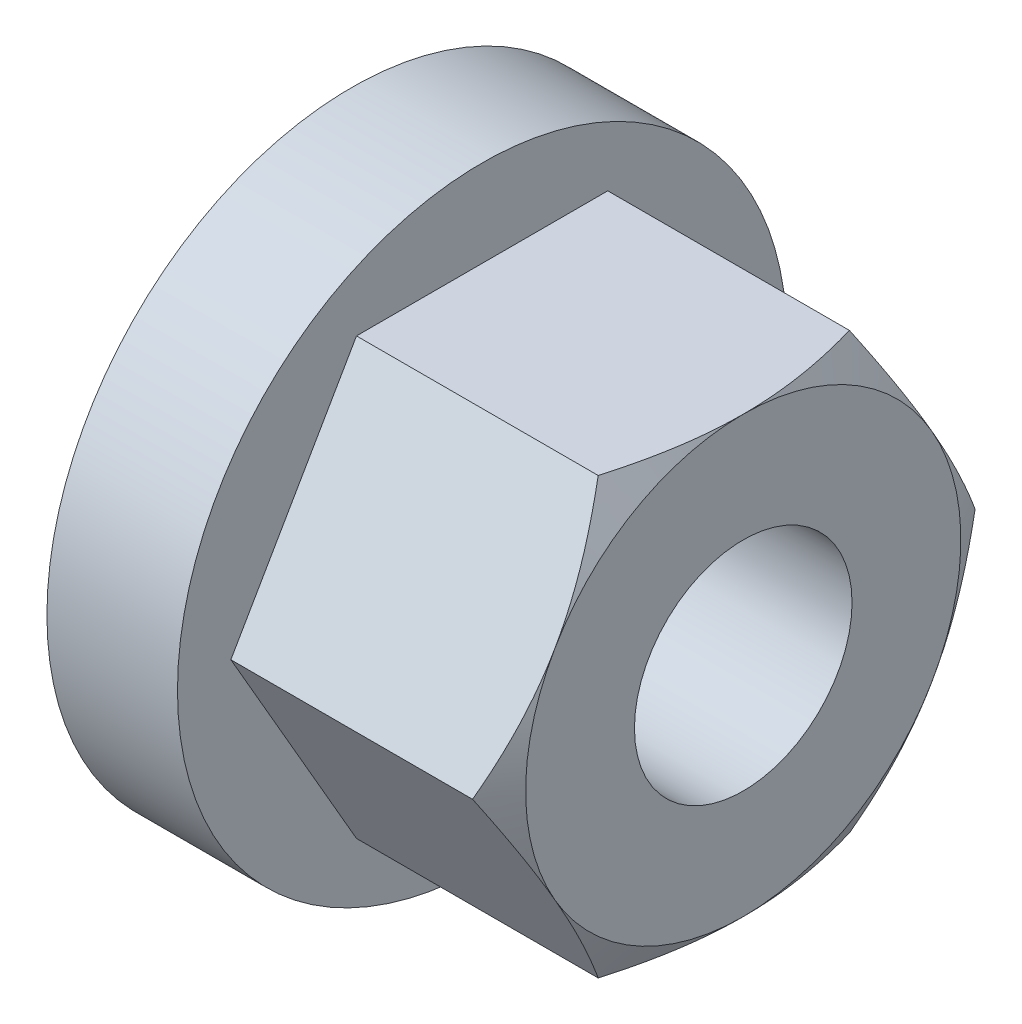
ISO-10303-21;
HEADER;
FILE_DESCRIPTION(('STEP AP214'),'2;1');
FILE_NAME('part.step','',(''),(''),'','','');
FILE_SCHEMA(('AUTOMOTIVE_DESIGN { 1 0 10303 214 1 1 1 1 }'));
ENDSEC;
DATA;
#1=APPLICATION_CONTEXT('core data for automotive mechanical design processes');
#2=APPLICATION_PROTOCOL_DEFINITION('international standard','automotive_design',2000,#1);
#3=PRODUCT_CONTEXT('',#1,'mechanical');
#4=PRODUCT('Part','Part','',(#3));
#5=PRODUCT_RELATED_PRODUCT_CATEGORY('part','',(#4));
#6=PRODUCT_DEFINITION_FORMATION('','',#4);
#7=PRODUCT_DEFINITION_CONTEXT('part definition',#1,'design');
#8=PRODUCT_DEFINITION('design','',#6,#7);
#9=PRODUCT_DEFINITION_SHAPE('','',#8);
#10=(LENGTH_UNIT() NAMED_UNIT(*) SI_UNIT(.MILLI.,.METRE.));
#11=(NAMED_UNIT(*) PLANE_ANGLE_UNIT() SI_UNIT($,.RADIAN.));
#12=(NAMED_UNIT(*) SI_UNIT($,.STERADIAN.) SOLID_ANGLE_UNIT());
#13=UNCERTAINTY_MEASURE_WITH_UNIT(LENGTH_MEASURE(1.E-05),#10,'distance_accuracy_value','');
#14=(GEOMETRIC_REPRESENTATION_CONTEXT(3) GLOBAL_UNCERTAINTY_ASSIGNED_CONTEXT((#13)) GLOBAL_UNIT_ASSIGNED_CONTEXT((#10,
#11,#12)) REPRESENTATION_CONTEXT('',''));
#15=CARTESIAN_POINT('',(0.,0.,0.));
#16=DIRECTION('',(0.,0.,1.));
#17=DIRECTION('',(1.,0.,0.));
#18=AXIS2_PLACEMENT_3D('',#15,#16,#17);
#19=CARTESIAN_POINT('',(9.,-5.,-2.88675134594813));
#20=DIRECTION('',(-1.,0.,0.));
#21=DIRECTION('',(0.,0.,1.));
#22=AXIS2_PLACEMENT_3D('',#19,#20,#21);
#23=PLANE('',#22);
#24=CARTESIAN_POINT('',(9.,0.,0.));
#25=DIRECTION('',(1.,0.,0.));
#26=DIRECTION('',(0.,0.,-1.));
#27=AXIS2_PLACEMENT_3D('',#24,#25,#26);
#28=CIRCLE('',#27,5.);
#29=CARTESIAN_POINT('',(9.,5.,0.));
#30=VERTEX_POINT('',#29);
#31=CARTESIAN_POINT('',(9.,2.5,4.3301270189222));
#32=VERTEX_POINT('',#31);
#33=EDGE_CURVE('E267',#30,#32,#28,.T.);
#34=ORIENTED_EDGE('',*,*,#33,.T.);
#35=CARTESIAN_POINT('',(9.,-2.5,4.33012701892219));
#36=VERTEX_POINT('',#35);
#37=EDGE_CURVE('E264',#32,#36,#28,.T.);
#38=ORIENTED_EDGE('',*,*,#37,.T.);
#39=CARTESIAN_POINT('',(9.,-5.,0.));
#40=VERTEX_POINT('',#39);
#41=EDGE_CURVE('E258',#36,#40,#28,.T.);
#42=ORIENTED_EDGE('',*,*,#41,.T.);
#43=CARTESIAN_POINT('',(9.,-2.5,-4.3301270189222));
#44=VERTEX_POINT('',#43);
#45=EDGE_CURVE('E260',#40,#44,#28,.T.);
#46=ORIENTED_EDGE('',*,*,#45,.T.);
#47=CARTESIAN_POINT('',(9.,2.5,-4.33012701892219));
#48=VERTEX_POINT('',#47);
#49=EDGE_CURVE('E263',#44,#48,#28,.T.);
#50=ORIENTED_EDGE('',*,*,#49,.T.);
#51=EDGE_CURVE('E58',#48,#30,#28,.T.);
#52=ORIENTED_EDGE('',*,*,#51,.T.);
#53=EDGE_LOOP('',(#34,#38,#42,#46,#50,#52));
#54=FACE_BOUND('',#53,.T.);
#55=CARTESIAN_POINT('',(9.,0.,0.));
#56=DIRECTION('',(1.,0.,0.));
#57=DIRECTION('',(0.,0.,-1.));
#58=AXIS2_PLACEMENT_3D('',#55,#56,#57);
#59=CIRCLE('',#58,2.5);
#60=CARTESIAN_POINT('',(9.,0.,-2.5));
#61=VERTEX_POINT('',#60);
#62=EDGE_CURVE('E134',#61,#61,#59,.T.);
#63=ORIENTED_EDGE('',*,*,#62,.F.);
#64=EDGE_LOOP('',(#63));
#65=FACE_BOUND('',#64,.T.);
#66=ADVANCED_FACE('F35',(#54,#65),#23,.F.);
#67=CARTESIAN_POINT('',(0.,-5.,-2.88675134594813));
#68=DIRECTION('',(-1.,0.,0.));
#69=DIRECTION('',(0.,0.,1.));
#70=AXIS2_PLACEMENT_3D('',#67,#68,#69);
#71=PLANE('',#70);
#72=CARTESIAN_POINT('',(0.,0.,0.));
#73=DIRECTION('',(1.,0.,0.));
#74=DIRECTION('',(0.,0.,-1.));
#75=AXIS2_PLACEMENT_3D('',#72,#73,#74);
#76=CIRCLE('',#75,2.5);
#77=CARTESIAN_POINT('',(0.,0.,-2.5));
#78=VERTEX_POINT('',#77);
#79=EDGE_CURVE('E266',#78,#78,#76,.T.);
#80=ORIENTED_EDGE('',*,*,#79,.T.);
#81=EDGE_LOOP('',(#80));
#82=FACE_BOUND('',#81,.T.);
#83=CARTESIAN_POINT('',(0.,0.,0.));
#84=DIRECTION('',(1.,0.,0.));
#85=DIRECTION('',(0.,0.,-1.));
#86=AXIS2_PLACEMENT_3D('',#83,#84,#85);
#87=CIRCLE('',#86,7.);
#88=CARTESIAN_POINT('',(0.,0.,-7.));
#89=VERTEX_POINT('',#88);
#90=EDGE_CURVE('E113',#89,#89,#87,.T.);
#91=ORIENTED_EDGE('',*,*,#90,.F.);
#92=EDGE_LOOP('',(#91));
#93=FACE_BOUND('',#92,.T.);
#94=ADVANCED_FACE('F223',(#82,#93),#71,.T.);
#95=CARTESIAN_POINT('',(9.,-5.,-2.88675134594813));
#96=DIRECTION('',(0.,0.5,0.866025403784439));
#97=DIRECTION('',(0.,-0.866025403784439,0.5));
#98=AXIS2_PLACEMENT_3D('',#95,#96,#97);
#99=PLANE('',#98);
#100=DIRECTION('',(-1.,0.,0.));
#101=VECTOR('',#100,1.);
#102=CARTESIAN_POINT('',(9.,-5.,-2.88675134594813));
#103=LINE('',#102,#101);
#104=CARTESIAN_POINT('',(8.5534180126149,-5.,-2.88675134594828));
#105=VERTEX_POINT('',#104);
#106=CARTESIAN_POINT('',(3.,-5.,-2.88675134594813));
#107=VERTEX_POINT('',#106);
#108=EDGE_CURVE('E130',#105,#107,#103,.T.);
#109=ORIENTED_EDGE('',*,*,#108,.T.);
#110=DIRECTION('',(0.,0.866025403784439,-0.5));
#111=VECTOR('',#110,1.);
#112=CARTESIAN_POINT('',(3.,-5.,-2.88675134594813));
#113=LINE('',#112,#111);
#114=CARTESIAN_POINT('',(3.,0.,-5.77350269189626));
#115=VERTEX_POINT('',#114);
#116=EDGE_CURVE('E50',#107,#115,#113,.T.);
#117=ORIENTED_EDGE('',*,*,#116,.T.);
#118=DIRECTION('',(-1.,0.,0.));
#119=VECTOR('',#118,1.);
#120=CARTESIAN_POINT('',(9.,0.,-5.77350269189626));
#121=LINE('',#120,#119);
#122=CARTESIAN_POINT('',(8.5534180126148,0.,-5.77350269189626));
#123=VERTEX_POINT('',#122);
#124=EDGE_CURVE('E11',#123,#115,#121,.T.);
#125=ORIENTED_EDGE('',*,*,#124,.F.);
#126=CARTESIAN_POINT('',(8.55335134394817,0.000200000000001834,-5.7736181619501));
#127=CARTESIAN_POINT('',(8.62661343236237,-0.219534594525184,-5.64675433465071));
#128=CARTESIAN_POINT('',(8.69324867808191,-0.441148584459579,-5.5188054379059));
#129=CARTESIAN_POINT('',(8.80956100898919,-0.888213995453512,-5.26069210252318));
#130=CARTESIAN_POINT('',(8.85919695008421,-1.11367335959077,-5.13052307794721));
#131=CARTESIAN_POINT('',(8.9364489745813,-1.56183230522351,-4.87177839004641));
#132=CARTESIAN_POINT('',(8.96457962171651,-1.78446209310419,-4.74324302208387));
#133=CARTESIAN_POINT('',(8.98980507804631,-2.11918990184664,-4.54998783160116));
#134=CARTESIAN_POINT('',(8.99538654023052,-2.23084219680506,-4.48552534905128));
#135=CARTESIAN_POINT('',(9.00079778324853,-2.4542499706738,-4.35654081066911));
#136=CARTESIAN_POINT('',(9.00062774174179,-2.56600544629031,-4.2920187567385));
#137=CARTESIAN_POINT('',(8.99224636820796,-2.87218423085064,-4.11524635305244));
#138=CARTESIAN_POINT('',(8.97817022810275,-3.06650608596721,-4.00305457769146));
#139=CARTESIAN_POINT('',(8.93353474289057,-3.45386010199771,-3.77941563226457));
#140=CARTESIAN_POINT('',(8.90296013985249,-3.64689090137157,-3.66796924828419));
#141=CARTESIAN_POINT('',(8.82653150637883,-4.03502534247485,-3.44387972423144));
#142=CARTESIAN_POINT('',(8.78035362112132,-4.23007999864174,-3.3312648659868));
#143=CARTESIAN_POINT('',(8.67554820550806,-4.61728034535877,-3.10771464157941));
#144=CARTESIAN_POINT('',(8.61694529656263,-4.80943099540809,-2.99677641204847));
#145=CARTESIAN_POINT('',(8.55335134394817,-5.0002,-2.88663587589429));
#146=B_SPLINE_CURVE_WITH_KNOTS('',3,(#126,#127,#128,#129,#130,#131,#132,#133,#134,#135,#136,
#137,#138,#139,#140,#141,#142,#143,#144,#145),.UNSPECIFIED.,.F.,.F.,(4,2,2,2,2,2,2,2,2,4),(0.,
0.792555841363091,1.58701660053333,2.36181537487281,2.74884076077325,3.13585419177295,
3.80962362599679,4.48401723901189,5.17336882348929,5.86136694793725),.UNSPECIFIED.);
#147=EDGE_CURVE('E159',#123,#44,#146,.T.);
#148=ORIENTED_EDGE('',*,*,#147,.T.);
#149=EDGE_CURVE('E155',#44,#105,#146,.T.);
#150=ORIENTED_EDGE('',*,*,#149,.T.);
#151=EDGE_LOOP('',(#109,#117,#125,#148,#150));
#152=FACE_BOUND('',#151,.T.);
#153=ADVANCED_FACE('F37',(#152),#99,.F.);
#154=CARTESIAN_POINT('',(9.,0.,-5.77350269189626));
#155=DIRECTION('',(0.,-0.5,0.866025403784438));
#156=DIRECTION('',(0.,-0.866025403784439,-0.5));
#157=AXIS2_PLACEMENT_3D('',#154,#155,#156);
#158=PLANE('',#157);
#159=ORIENTED_EDGE('',*,*,#124,.T.);
#160=DIRECTION('',(0.,0.866025403784439,0.5));
#161=VECTOR('',#160,1.);
#162=CARTESIAN_POINT('',(3.,0.,-5.77350269189626));
#163=LINE('',#162,#161);
#164=CARTESIAN_POINT('',(3.,5.,-2.88675134594813));
#165=VERTEX_POINT('',#164);
#166=EDGE_CURVE('E153',#115,#165,#163,.T.);
#167=ORIENTED_EDGE('',*,*,#166,.T.);
#168=DIRECTION('',(-1.,0.,0.));
#169=VECTOR('',#168,1.);
#170=CARTESIAN_POINT('',(9.,5.,-2.88675134594813));
#171=LINE('',#170,#169);
#172=CARTESIAN_POINT('',(8.5534180126148,5.,-2.88675134594813));
#173=VERTEX_POINT('',#172);
#174=EDGE_CURVE('E43',#173,#165,#171,.T.);
#175=ORIENTED_EDGE('',*,*,#174,.F.);
#176=CARTESIAN_POINT('',(8.55335134394817,5.0002,-2.88663587589429));
#177=CARTESIAN_POINT('',(8.62661343236237,4.78046540547482,-3.01349970319368));
#178=CARTESIAN_POINT('',(8.69324867808191,4.55885141554042,-3.14144859993849));
#179=CARTESIAN_POINT('',(8.80956100898919,4.11178600454649,-3.39956193532121));
#180=CARTESIAN_POINT('',(8.85919695008421,3.88632664040923,-3.52973095989718));
#181=CARTESIAN_POINT('',(8.9364489745813,3.43816769477649,-3.78847564779798));
#182=CARTESIAN_POINT('',(8.96457962171651,3.21553790689581,-3.91701101576052));
#183=CARTESIAN_POINT('',(8.98980507804631,2.88081009815336,-4.11026620624322));
#184=CARTESIAN_POINT('',(8.99538654023052,2.76915780319494,-4.17472868879311));
#185=CARTESIAN_POINT('',(9.00079778324853,2.5457500293262,-4.30371322717528));
#186=CARTESIAN_POINT('',(9.00062774174179,2.43399455370969,-4.36823528110589));
#187=CARTESIAN_POINT('',(8.99224636820796,2.12781576914936,-4.54500768479194));
#188=CARTESIAN_POINT('',(8.97817022810275,1.93349391403279,-4.65719946015292));
#189=CARTESIAN_POINT('',(8.93353474289057,1.54613989800229,-4.88083840557981));
#190=CARTESIAN_POINT('',(8.90296013985249,1.35310909862843,-4.9922847895602));
#191=CARTESIAN_POINT('',(8.82653150637883,0.964974657525146,-5.21637431361295));
#192=CARTESIAN_POINT('',(8.78035362112132,0.769920001358265,-5.32898917185759));
#193=CARTESIAN_POINT('',(8.67554820550806,0.382719654641233,-5.55253939626498));
#194=CARTESIAN_POINT('',(8.61694529656263,0.190569004591915,-5.66347762579592));
#195=CARTESIAN_POINT('',(8.55335134394817,-0.000199999999998209,-5.7736181619501));
#196=B_SPLINE_CURVE_WITH_KNOTS('',3,(#176,#177,#178,#179,#180,#181,#182,#183,#184,#185,#186,
#187,#188,#189,#190,#191,#192,#193,#194,#195),.UNSPECIFIED.,.F.,.F.,(4,2,2,2,2,2,2,2,2,4),(0.,
0.792555841363091,1.58701660053333,2.36181537487281,2.74884076077325,3.13585419177295,
3.80962362599679,4.48401723901189,5.17336882348929,5.86136694793725),.UNSPECIFIED.);
#197=EDGE_CURVE('E151',#173,#48,#196,.T.);
#198=ORIENTED_EDGE('',*,*,#197,.T.);
#199=EDGE_CURVE('E156',#48,#123,#196,.T.);
#200=ORIENTED_EDGE('',*,*,#199,.T.);
#201=EDGE_LOOP('',(#159,#167,#175,#198,#200));
#202=FACE_BOUND('',#201,.T.);
#203=ADVANCED_FACE('F150',(#202),#158,.F.);
#204=CARTESIAN_POINT('',(9.,5.,-2.88675134594813));
#205=DIRECTION('',(0.,-1.,0.));
#206=DIRECTION('',(0.,0.,-1.));
#207=AXIS2_PLACEMENT_3D('',#204,#205,#206);
#208=PLANE('',#207);
#209=ORIENTED_EDGE('',*,*,#174,.T.);
#210=DIRECTION('',(0.,0.,1.));
#211=VECTOR('',#210,1.);
#212=CARTESIAN_POINT('',(3.,5.,-2.88675134594813));
#213=LINE('',#212,#211);
#214=CARTESIAN_POINT('',(3.,5.,2.88675134594813));
#215=VERTEX_POINT('',#214);
#216=EDGE_CURVE('E145',#165,#215,#213,.T.);
#217=ORIENTED_EDGE('',*,*,#216,.T.);
#218=DIRECTION('',(-1.,0.,0.));
#219=VECTOR('',#218,1.);
#220=CARTESIAN_POINT('',(9.,5.,2.88675134594813));
#221=LINE('',#220,#219);
#222=CARTESIAN_POINT('',(8.5534180126148,5.,2.88675134594813));
#223=VERTEX_POINT('',#222);
#224=EDGE_CURVE('E132',#223,#215,#221,.T.);
#225=ORIENTED_EDGE('',*,*,#224,.F.);
#226=CARTESIAN_POINT('',(6.48448929523147,5.,-7.90906478629684));
#227=CARTESIAN_POINT('',(6.59174307035201,5.,-7.68922933003721));
#228=CARTESIAN_POINT('',(6.69801191127205,5.,-7.46890534686134));
#229=CARTESIAN_POINT('',(6.90802834110444,5.,-7.02702088983404));
#230=CARTESIAN_POINT('',(7.0117755600927,5.,-6.80546024035528));
#231=CARTESIAN_POINT('',(7.21668600160169,5.,-6.35977544010411));
#232=CARTESIAN_POINT('',(7.31783338092474,5.,-6.13564398109197));
#233=CARTESIAN_POINT('',(7.51618751186578,5.,-5.68565055503932));
#234=CARTESIAN_POINT('',(7.61339444038338,5.,-5.45978866622586));
#235=CARTESIAN_POINT('',(7.806021142281,5.,-4.99833465053588));
#236=CARTESIAN_POINT('',(7.90127047568337,5.,-4.76267100254544));
#237=CARTESIAN_POINT('',(8.08492801300854,5.,-4.28864493844213));
#238=CARTESIAN_POINT('',(8.17333547221495,5.,-4.05028223177305));
#239=CARTESIAN_POINT('',(8.34110276026423,5.,-3.57087585579334));
#240=CARTESIAN_POINT('',(8.42047958297895,5.,-3.32983819130105));
#241=CARTESIAN_POINT('',(8.56774240993101,5.,-2.8443097263888));
#242=CARTESIAN_POINT('',(8.63563186919281,5.,-2.59981998829521));
#243=CARTESIAN_POINT('',(8.75642527299514,5.,-2.10852834885564));
#244=CARTESIAN_POINT('',(8.80940965191985,5.,-1.86174658401204));
#245=CARTESIAN_POINT('',(8.89747284476097,5.,-1.36496099975578));
#246=CARTESIAN_POINT('',(8.93255382845547,5.,-1.11495757455495));
#247=CARTESIAN_POINT('',(8.98156277030728,5.,-0.616293379734346));
#248=CARTESIAN_POINT('',(8.99577400726068,5.,-0.367661157070577));
#249=CARTESIAN_POINT('',(9.00259479077221,5.,0.129933430466147));
#250=CARTESIAN_POINT('',(8.99520358482019,5.,0.378895806537867));
#251=CARTESIAN_POINT('',(8.96519097353061,5.,0.796934306291568));
#252=CARTESIAN_POINT('',(8.94810954229557,5.,0.966436165917864));
#253=CARTESIAN_POINT('',(8.90491433894597,5.,1.30429236001717));
#254=CARTESIAN_POINT('',(8.87879947975788,5.,1.47264655389375));
#255=CARTESIAN_POINT('',(8.78826926079879,5.,1.97569119689688));
#256=CARTESIAN_POINT('',(8.71167999312009,5.,2.30822029871104));
#257=CARTESIAN_POINT('',(8.57760877225042,5.,2.80598941986571));
#258=CARTESIAN_POINT('',(8.52900900786635,5.,2.97376912288904));
#259=CARTESIAN_POINT('',(8.42645718623318,5.,3.30770085290179));
#260=CARTESIAN_POINT('',(8.37250508023843,5.,3.47385286505212));
#261=CARTESIAN_POINT('',(8.26013742966787,5.,3.8045846330687));
#262=CARTESIAN_POINT('',(8.20172289354515,5.,3.96916473476435));
#263=CARTESIAN_POINT('',(8.08115376438758,5.,4.2969368343954));
#264=CARTESIAN_POINT('',(8.01899933827777,5.,4.46012889391369));
#265=CARTESIAN_POINT('',(7.88078707133395,5.,4.812769121178));
#266=CARTESIAN_POINT('',(7.80415521533064,5.,5.00199173382058));
#267=CARTESIAN_POINT('',(7.64739455455253,5.,5.37898612497287));
#268=CARTESIAN_POINT('',(7.56726559861764,5.,5.56675784035466));
#269=CARTESIAN_POINT('',(7.32257555121118,5.,6.12827145983533));
#270=CARTESIAN_POINT('',(7.15373675093187,5.,6.50014815874414));
#271=CARTESIAN_POINT('',(6.80812368288085,5.,7.24048396212812));
#272=CARTESIAN_POINT('',(6.63134381227776,5.,7.60894042506202));
#273=CARTESIAN_POINT('',(6.2722162906634,5.,8.34308000084656));
#274=CARTESIAN_POINT('',(6.0898691590069,5.,8.7087633684427));
#275=CARTESIAN_POINT('',(5.72063979247454,5.,9.43895432815398));
#276=CARTESIAN_POINT('',(5.53374752380377,5.,9.80345683046996));
#277=CARTESIAN_POINT('',(5.15687970576314,5.,10.530871068123));
#278=CARTESIAN_POINT('',(4.96690409385762,5.,10.8937827710057));
#279=CARTESIAN_POINT('',(4.58467009362727,5.,11.6182085059666));
#280=CARTESIAN_POINT('',(4.39241268169207,5.,11.9797230539209));
#281=CARTESIAN_POINT('',(4.00604804003268,5.,12.7017628566435));
#282=CARTESIAN_POINT('',(3.81194080413343,5.,13.0622881081043));
#283=CARTESIAN_POINT('',(3.28430601749336,5.,14.0375403431958));
#284=CARTESIAN_POINT('',(2.9493760559518,5.,14.6515083007263));
#285=CARTESIAN_POINT('',(2.27649792632048,5.,15.8778806909322));
#286=CARTESIAN_POINT('',(1.9385494015391,5.,16.4902849275337));
#287=CARTESIAN_POINT('',(1.26200092804524,5.,17.7111639594718));
#288=CARTESIAN_POINT('',(0.923410611492486,5.,18.3196440965451));
#289=CARTESIAN_POINT('',(0.244634071770802,5.,19.5356091130006));
#290=CARTESIAN_POINT('',(-0.0955519360711181,5.,20.1430941125439));
#291=CARTESIAN_POINT('',(-0.436305963898583,5.,20.7502584173138));
#292=B_SPLINE_CURVE_WITH_KNOTS('',3,(#226,#227,#228,#229,#230,#231,#232,#233,#234,#235,#236,
#237,#238,#239,#240,#241,#242,#243,#244,#245,#246,#247,#248,#249,#250,#251,#252,#253,#254,#255,
#256,#257,#258,#259,#260,#261,#262,#263,#264,#265,#266,#267,#268,#269,#270,#271,#272,#273,#274,
#275,#276,#277,#278,#279,#280,#281,#282,#283,#284,#285,#286,#287,#288,#289,#290,#291),
.UNSPECIFIED.,.F.,.F.,(4,2,2,2,2,2,2,2,2,2,2,2,2,2,2,2,2,2,2,2,2,2,2,2,2,2,2,2,2,2,2,2,4),(0.,
0.733819548727558,1.46774610747581,2.20540890934201,2.94303855837576,3.70551003869572,
4.46806439524,5.22915917206035,5.9900246279106,6.74670170553277,7.50328705689581,
8.24950468983482,8.99574831719693,9.50658495115704,10.0174830800767,11.0397090231468,
11.5636902202365,12.0876761898448,12.6115440935327,13.135388632391,13.7477974844773,
14.3602328338429,15.5853091840293,16.8112638979354,18.0371045931925,19.2659544334222,
20.4948292281218,21.7231958936127,22.9515666610632,25.04969832131,27.1480812787319,
29.2371028885977,31.3258502752956),.UNSPECIFIED.);
#293=EDGE_CURVE('E161',#223,#30,#292,.F.);
#294=ORIENTED_EDGE('',*,*,#293,.T.);
#295=EDGE_CURVE('E147',#30,#173,#292,.F.);
#296=ORIENTED_EDGE('',*,*,#295,.T.);
#297=EDGE_LOOP('',(#209,#217,#225,#294,#296));
#298=FACE_BOUND('',#297,.T.);
#299=ADVANCED_FACE('F143',(#298),#208,.F.);
#300=CARTESIAN_POINT('',(9.,5.,2.88675134594813));
#301=DIRECTION('',(0.,-0.5,-0.866025403784439));
#302=DIRECTION('',(0.,0.866025403784439,-0.5));
#303=AXIS2_PLACEMENT_3D('',#300,#301,#302);
#304=PLANE('',#303);
#305=ORIENTED_EDGE('',*,*,#224,.T.);
#306=DIRECTION('',(0.,-0.866025403784439,0.5));
#307=VECTOR('',#306,1.);
#308=CARTESIAN_POINT('',(3.,5.,2.88675134594813));
#309=LINE('',#308,#307);
#310=CARTESIAN_POINT('',(3.,0.,5.77350269189626));
#311=VERTEX_POINT('',#310);
#312=EDGE_CURVE('E124',#215,#311,#309,.T.);
#313=ORIENTED_EDGE('',*,*,#312,.T.);
#314=DIRECTION('',(-1.,0.,0.));
#315=VECTOR('',#314,1.);
#316=CARTESIAN_POINT('',(9.,0.,5.77350269189626));
#317=LINE('',#316,#315);
#318=CARTESIAN_POINT('',(8.5534180126148,0.,5.77350269189626));
#319=VERTEX_POINT('',#318);
#320=EDGE_CURVE('E123',#319,#311,#317,.T.);
#321=ORIENTED_EDGE('',*,*,#320,.F.);
#322=CARTESIAN_POINT('',(8.55335134394817,-0.000200000000000837,5.77361816195009));
#323=CARTESIAN_POINT('',(8.62661343236237,0.219534594525185,5.64675433465071));
#324=CARTESIAN_POINT('',(8.69324867808191,0.44114858445958,5.5188054379059));
#325=CARTESIAN_POINT('',(8.80956100898919,0.888213995453513,5.26069210252318));
#326=CARTESIAN_POINT('',(8.85919695008421,1.11367335959077,5.13052307794721));
#327=CARTESIAN_POINT('',(8.9364489745813,1.56183230522351,4.87177839004641));
#328=CARTESIAN_POINT('',(8.96457962171651,1.78446209310419,4.74324302208387));
#329=CARTESIAN_POINT('',(8.98980507804631,2.11918990184664,4.54998783160116));
#330=CARTESIAN_POINT('',(8.99538654023052,2.23084219680506,4.48552534905128));
#331=CARTESIAN_POINT('',(9.00079778324853,2.4542499706738,4.35654081066911));
#332=CARTESIAN_POINT('',(9.00062774174179,2.56600544629031,4.2920187567385));
#333=CARTESIAN_POINT('',(8.99224636820796,2.87218423085064,4.11524635305244));
#334=CARTESIAN_POINT('',(8.97817022810275,3.06650608596721,4.00305457769146));
#335=CARTESIAN_POINT('',(8.93353474289057,3.45386010199771,3.77941563226457));
#336=CARTESIAN_POINT('',(8.90296013985249,3.64689090137157,3.66796924828418));
#337=CARTESIAN_POINT('',(8.82653150637883,4.03502534247485,3.44387972423144));
#338=CARTESIAN_POINT('',(8.78035362112132,4.23007999864174,3.3312648659868));
#339=CARTESIAN_POINT('',(8.67554820550806,4.61728034535877,3.1077146415794));
#340=CARTESIAN_POINT('',(8.61694529656263,4.80943099540809,2.99677641204847));
#341=CARTESIAN_POINT('',(8.55335134394817,5.0002,2.88663587589429));
#342=B_SPLINE_CURVE_WITH_KNOTS('',3,(#322,#323,#324,#325,#326,#327,#328,#329,#330,#331,#332,
#333,#334,#335,#336,#337,#338,#339,#340,#341),.UNSPECIFIED.,.F.,.F.,(4,2,2,2,2,2,2,2,2,4),(0.,
0.792555841363091,1.58701660053333,2.36181537487281,2.74884076077325,3.13585419177295,
3.80962362599679,4.48401723901189,5.17336882348929,5.86136694793725),.UNSPECIFIED.);
#343=EDGE_CURVE('E194',#319,#32,#342,.T.);
#344=ORIENTED_EDGE('',*,*,#343,.T.);
#345=EDGE_CURVE('E189',#32,#223,#342,.T.);
#346=ORIENTED_EDGE('',*,*,#345,.T.);
#347=EDGE_LOOP('',(#305,#313,#321,#344,#346));
#348=FACE_BOUND('',#347,.T.);
#349=ADVANCED_FACE('F239',(#348),#304,.F.);
#350=CARTESIAN_POINT('',(9.,0.,5.77350269189626));
#351=DIRECTION('',(0.,0.5,-0.866025403784439));
#352=DIRECTION('',(0.,0.866025403784439,0.5));
#353=AXIS2_PLACEMENT_3D('',#350,#351,#352);
#354=PLANE('',#353);
#355=ORIENTED_EDGE('',*,*,#320,.T.);
#356=DIRECTION('',(0.,-0.866025403784439,-0.5));
#357=VECTOR('',#356,1.);
#358=CARTESIAN_POINT('',(3.,0.,5.77350269189626));
#359=LINE('',#358,#357);
#360=CARTESIAN_POINT('',(3.,-5.,2.88675134594813));
#361=VERTEX_POINT('',#360);
#362=EDGE_CURVE('E108',#311,#361,#359,.T.);
#363=ORIENTED_EDGE('',*,*,#362,.T.);
#364=DIRECTION('',(-1.,0.,0.));
#365=VECTOR('',#364,1.);
#366=CARTESIAN_POINT('',(9.,-5.,2.88675134594813));
#367=LINE('',#366,#365);
#368=CARTESIAN_POINT('',(8.5534180126148,-5.,2.88675134594813));
#369=VERTEX_POINT('',#368);
#370=EDGE_CURVE('E120',#369,#361,#367,.T.);
#371=ORIENTED_EDGE('',*,*,#370,.F.);
#372=CARTESIAN_POINT('',(8.55335134394817,-5.0002,2.88663587589429));
#373=CARTESIAN_POINT('',(8.62661343236236,-4.78046540547481,3.01349970319368));
#374=CARTESIAN_POINT('',(8.69324867808191,-4.55885141554042,3.14144859993849));
#375=CARTESIAN_POINT('',(8.80956100898919,-4.11178600454649,3.39956193532121));
#376=CARTESIAN_POINT('',(8.85919695008421,-3.88632664040923,3.52973095989718));
#377=CARTESIAN_POINT('',(8.9364489745813,-3.43816769477649,3.78847564779798));
#378=CARTESIAN_POINT('',(8.96457962171651,-3.21553790689581,3.91701101576052));
#379=CARTESIAN_POINT('',(8.98980507804631,-2.88081009815336,4.11026620624322));
#380=CARTESIAN_POINT('',(8.99538654023051,-2.76915780319494,4.17472868879311));
#381=CARTESIAN_POINT('',(9.00079778324853,-2.5457500293262,4.30371322717528));
#382=CARTESIAN_POINT('',(9.00062774174179,-2.43399455370969,4.36823528110589));
#383=CARTESIAN_POINT('',(8.99224636820796,-2.12781576914936,4.54500768479194));
#384=CARTESIAN_POINT('',(8.97817022810275,-1.93349391403279,4.65719946015292));
#385=CARTESIAN_POINT('',(8.93353474289057,-1.54613989800229,4.88083840557981));
#386=CARTESIAN_POINT('',(8.90296013985249,-1.35310909862843,4.9922847895602));
#387=CARTESIAN_POINT('',(8.82653150637883,-0.964974657525145,5.21637431361295));
#388=CARTESIAN_POINT('',(8.78035362112132,-0.769920001358264,5.32898917185759));
#389=CARTESIAN_POINT('',(8.67554820550806,-0.382719654641231,5.55253939626498));
#390=CARTESIAN_POINT('',(8.61694529656263,-0.190569004591913,5.66347762579592));
#391=CARTESIAN_POINT('',(8.55335134394817,0.000199999999999405,5.7736181619501));
#392=B_SPLINE_CURVE_WITH_KNOTS('',3,(#372,#373,#374,#375,#376,#377,#378,#379,#380,#381,#382,
#383,#384,#385,#386,#387,#388,#389,#390,#391),.UNSPECIFIED.,.F.,.F.,(4,2,2,2,2,2,2,2,2,4),(0.,
0.79255584136309,1.58701660053333,2.36181537487281,2.74884076077325,3.13585419177295,
3.80962362599679,4.48401723901189,5.17336882348929,5.86136694793725),.UNSPECIFIED.);
#393=EDGE_CURVE('E195',#369,#36,#392,.T.);
#394=ORIENTED_EDGE('',*,*,#393,.T.);
#395=EDGE_CURVE('E196',#36,#319,#392,.T.);
#396=ORIENTED_EDGE('',*,*,#395,.T.);
#397=EDGE_LOOP('',(#355,#363,#371,#394,#396));
#398=FACE_BOUND('',#397,.T.);
#399=ADVANCED_FACE('F118',(#398),#354,.F.);
#400=CARTESIAN_POINT('',(9.,-5.,2.88675134594813));
#401=DIRECTION('',(0.,1.,0.));
#402=DIRECTION('',(0.,0.,1.));
#403=AXIS2_PLACEMENT_3D('',#400,#401,#402);
#404=PLANE('',#403);
#405=ORIENTED_EDGE('',*,*,#370,.T.);
#406=DIRECTION('',(0.,0.,-1.));
#407=VECTOR('',#406,1.);
#408=CARTESIAN_POINT('',(3.,-5.,2.88675134594813));
#409=LINE('',#408,#407);
#410=EDGE_CURVE('E105',#361,#107,#409,.T.);
#411=ORIENTED_EDGE('',*,*,#410,.T.);
#412=ORIENTED_EDGE('',*,*,#108,.F.);
#413=CARTESIAN_POINT('',(6.48448929523146,-5.,-7.90906478629684));
#414=CARTESIAN_POINT('',(6.59174307035201,-5.,-7.68922933003721));
#415=CARTESIAN_POINT('',(6.69801191127204,-5.,-7.46890534686135));
#416=CARTESIAN_POINT('',(6.90802834110444,-5.,-7.02702088983405));
#417=CARTESIAN_POINT('',(7.0117755600927,-5.,-6.80546024035528));
#418=CARTESIAN_POINT('',(7.21668600160169,-5.,-6.35977544010411));
#419=CARTESIAN_POINT('',(7.31783338092473,-5.,-6.13564398109197));
#420=CARTESIAN_POINT('',(7.51618751186578,-5.,-5.68565055503932));
#421=CARTESIAN_POINT('',(7.61339444038338,-5.,-5.45978866622586));
#422=CARTESIAN_POINT('',(7.806021142281,-5.,-4.99833465053589));
#423=CARTESIAN_POINT('',(7.90127047568337,-5.,-4.76267100254545));
#424=CARTESIAN_POINT('',(8.08492801300853,-5.,-4.28864493844213));
#425=CARTESIAN_POINT('',(8.17333547221495,-5.,-4.05028223177305));
#426=CARTESIAN_POINT('',(8.34110276026423,-5.,-3.57087585579335));
#427=CARTESIAN_POINT('',(8.42047958297895,-5.,-3.32983819130106));
#428=CARTESIAN_POINT('',(8.56774240993101,-5.,-2.8443097263888));
#429=CARTESIAN_POINT('',(8.63563186919281,-5.,-2.59981998829522));
#430=CARTESIAN_POINT('',(8.75642527299514,-5.,-2.10852834885565));
#431=CARTESIAN_POINT('',(8.80940965191985,-5.,-1.86174658401204));
#432=CARTESIAN_POINT('',(8.89747284476097,-5.,-1.36496099975578));
#433=CARTESIAN_POINT('',(8.93255382845547,-5.,-1.11495757455495));
#434=CARTESIAN_POINT('',(8.98156277030728,-5.,-0.616293379734348));
#435=CARTESIAN_POINT('',(8.99577400726068,-5.,-0.367661157070578));
#436=CARTESIAN_POINT('',(9.00259479077221,-5.,0.129933430466146));
#437=CARTESIAN_POINT('',(8.99520358482019,-5.,0.378895806537867));
#438=CARTESIAN_POINT('',(8.96519097353061,-5.,0.796934306291568));
#439=CARTESIAN_POINT('',(8.94810954229557,-5.,0.966436165917864));
#440=CARTESIAN_POINT('',(8.90491433894597,-5.,1.30429236001717));
#441=CARTESIAN_POINT('',(8.87879947975788,-5.,1.47264655389375));
#442=CARTESIAN_POINT('',(8.78826926079879,-5.,1.97569119689688));
#443=CARTESIAN_POINT('',(8.71167999312009,-5.,2.30822029871104));
#444=CARTESIAN_POINT('',(8.57760877225042,-5.,2.80598941986571));
#445=CARTESIAN_POINT('',(8.52900900786634,-5.,2.97376912288904));
#446=CARTESIAN_POINT('',(8.42645718623318,-5.,3.3077008529018));
#447=CARTESIAN_POINT('',(8.37250508023843,-5.,3.47385286505212));
#448=CARTESIAN_POINT('',(8.26013742966787,-5.,3.8045846330687));
#449=CARTESIAN_POINT('',(8.20172289354514,-5.,3.96916473476435));
#450=CARTESIAN_POINT('',(8.08115376438758,-5.,4.2969368343954));
#451=CARTESIAN_POINT('',(8.01899933827777,-5.,4.46012889391369));
#452=CARTESIAN_POINT('',(7.88078707133395,-5.,4.81276912117801));
#453=CARTESIAN_POINT('',(7.80415521533064,-5.,5.00199173382058));
#454=CARTESIAN_POINT('',(7.64739455455252,-5.,5.37898612497287));
#455=CARTESIAN_POINT('',(7.56726559861764,-5.,5.56675784035467));
#456=CARTESIAN_POINT('',(7.32257555121118,-5.,6.12827145983534));
#457=CARTESIAN_POINT('',(7.15373675093186,-5.,6.50014815874415));
#458=CARTESIAN_POINT('',(6.80812368288085,-5.,7.24048396212812));
#459=CARTESIAN_POINT('',(6.63134381227775,-5.,7.60894042506203));
#460=CARTESIAN_POINT('',(6.2722162906634,-5.,8.34308000084657));
#461=CARTESIAN_POINT('',(6.08986915900689,-5.,8.70876336844271));
#462=CARTESIAN_POINT('',(5.72063979247453,-5.,9.438954328154));
#463=CARTESIAN_POINT('',(5.53374752380376,-5.,9.80345683046998));
#464=CARTESIAN_POINT('',(5.15687970576312,-5.,10.530871068123));
#465=CARTESIAN_POINT('',(4.9669040938576,-5.,10.8937827710057));
#466=CARTESIAN_POINT('',(4.58467009362726,-5.,11.6182085059667));
#467=CARTESIAN_POINT('',(4.39241268169205,-5.,11.9797230539209));
#468=CARTESIAN_POINT('',(4.00604804003266,-5.,12.7017628566436));
#469=CARTESIAN_POINT('',(3.81194080413342,-5.,13.0622881081043));
#470=CARTESIAN_POINT('',(3.28430601749335,-5.,14.0375403431958));
#471=CARTESIAN_POINT('',(2.94937605595179,-5.,14.6515083007263));
#472=CARTESIAN_POINT('',(2.27649792632047,-5.,15.8778806909322));
#473=CARTESIAN_POINT('',(1.93854940153909,-5.,16.4902849275338));
#474=CARTESIAN_POINT('',(1.26200092804523,-5.,17.7111639594718));
#475=CARTESIAN_POINT('',(0.92341061149248,-5.,18.3196440965451));
#476=CARTESIAN_POINT('',(0.244634071770798,-5.,19.5356091130006));
#477=CARTESIAN_POINT('',(-0.0955519360711208,-5.,20.1430941125439));
#478=CARTESIAN_POINT('',(-0.436305963898584,-5.,20.7502584173138));
#479=B_SPLINE_CURVE_WITH_KNOTS('',3,(#413,#414,#415,#416,#417,#418,#419,#420,#421,#422,#423,
#424,#425,#426,#427,#428,#429,#430,#431,#432,#433,#434,#435,#436,#437,#438,#439,#440,#441,#442,
#443,#444,#445,#446,#447,#448,#449,#450,#451,#452,#453,#454,#455,#456,#457,#458,#459,#460,#461,
#462,#463,#464,#465,#466,#467,#468,#469,#470,#471,#472,#473,#474,#475,#476,#477,#478),
.UNSPECIFIED.,.F.,.F.,(4,2,2,2,2,2,2,2,2,2,2,2,2,2,2,2,2,2,2,2,2,2,2,2,2,2,2,2,2,2,2,2,4),(0.,
0.733819548727558,1.46774610747581,2.20540890934201,2.94303855837577,3.70551003869573,
4.46806439524,5.22915917206035,5.9900246279106,6.74670170553278,7.50328705689582,
8.24950468983483,8.99574831719694,9.50658495115705,10.0174830800767,11.0397090231468,
11.5636902202365,12.0876761898448,12.6115440935327,13.135388632391,13.7477974844773,
14.3602328338429,15.5853091840293,16.8112638979354,18.0371045931925,19.2659544334222,
20.4948292281218,21.7231958936128,22.9515666610633,25.0496983213101,27.1480812787319,
29.2371028885978,31.3258502752956),.UNSPECIFIED.);
#480=EDGE_CURVE('E201',#105,#40,#479,.T.);
#481=ORIENTED_EDGE('',*,*,#480,.T.);
#482=EDGE_CURVE('E129',#40,#369,#479,.T.);
#483=ORIENTED_EDGE('',*,*,#482,.T.);
#484=EDGE_LOOP('',(#405,#411,#412,#481,#483));
#485=FACE_BOUND('',#484,.T.);
#486=ADVANCED_FACE('F126',(#485),#404,.F.);
#487=CARTESIAN_POINT('',(9.,0.,0.));
#488=DIRECTION('',(-1.,0.,0.));
#489=DIRECTION('',(0.,0.,1.));
#490=AXIS2_PLACEMENT_3D('',#487,#488,#489);
#491=CYLINDRICAL_SURFACE('',#490,2.5);
#492=ORIENTED_EDGE('',*,*,#62,.T.);
#493=EDGE_LOOP('',(#492));
#494=FACE_BOUND('',#493,.T.);
#495=ORIENTED_EDGE('',*,*,#79,.F.);
#496=EDGE_LOOP('',(#495));
#497=FACE_BOUND('',#496,.T.);
#498=ADVANCED_FACE('F233',(#494,#497),#491,.F.);
#499=CARTESIAN_POINT('',(9.,0.,0.));
#500=DIRECTION('',(-1.,0.,0.));
#501=DIRECTION('',(0.,0.,-1.));
#502=AXIS2_PLACEMENT_3D('',#499,#500,#501);
#503=CONICAL_SURFACE('',#502,5.,1.0471975511966);
#504=ORIENTED_EDGE('',*,*,#393,.F.);
#505=ORIENTED_EDGE('',*,*,#482,.F.);
#506=ORIENTED_EDGE('',*,*,#41,.F.);
#507=EDGE_LOOP('',(#504,#505,#506));
#508=FACE_BOUND('',#507,.T.);
#509=ADVANCED_FACE('F257',(#508),#503,.T.);
#510=ORIENTED_EDGE('',*,*,#149,.F.);
#511=ORIENTED_EDGE('',*,*,#45,.F.);
#512=ORIENTED_EDGE('',*,*,#480,.F.);
#513=EDGE_LOOP('',(#510,#511,#512));
#514=FACE_BOUND('',#513,.T.);
#515=ADVANCED_FACE('F261',(#514),#503,.T.);
#516=ORIENTED_EDGE('',*,*,#343,.F.);
#517=ORIENTED_EDGE('',*,*,#395,.F.);
#518=ORIENTED_EDGE('',*,*,#37,.F.);
#519=EDGE_LOOP('',(#516,#517,#518));
#520=FACE_BOUND('',#519,.T.);
#521=ADVANCED_FACE('F220',(#520),#503,.T.);
#522=ORIENTED_EDGE('',*,*,#293,.F.);
#523=ORIENTED_EDGE('',*,*,#345,.F.);
#524=ORIENTED_EDGE('',*,*,#33,.F.);
#525=EDGE_LOOP('',(#522,#523,#524));
#526=FACE_BOUND('',#525,.T.);
#527=ADVANCED_FACE('F178',(#526),#503,.T.);
#528=ORIENTED_EDGE('',*,*,#295,.F.);
#529=ORIENTED_EDGE('',*,*,#51,.F.);
#530=ORIENTED_EDGE('',*,*,#197,.F.);
#531=EDGE_LOOP('',(#528,#529,#530));
#532=FACE_BOUND('',#531,.T.);
#533=ADVANCED_FACE('F154',(#532),#503,.T.);
#534=ORIENTED_EDGE('',*,*,#199,.F.);
#535=ORIENTED_EDGE('',*,*,#49,.F.);
#536=ORIENTED_EDGE('',*,*,#147,.F.);
#537=EDGE_LOOP('',(#534,#535,#536));
#538=FACE_BOUND('',#537,.T.);
#539=ADVANCED_FACE('F214',(#538),#503,.T.);
#540=CARTESIAN_POINT('',(3.,7.,0.));
#541=DIRECTION('',(1.,0.,0.));
#542=DIRECTION('',(0.,0.,-1.));
#543=AXIS2_PLACEMENT_3D('',#540,#541,#542);
#544=PLANE('',#543);
#545=CARTESIAN_POINT('',(3.,0.,0.));
#546=DIRECTION('',(1.,0.,0.));
#547=DIRECTION('',(0.,0.,-1.));
#548=AXIS2_PLACEMENT_3D('',#545,#546,#547);
#549=CIRCLE('',#548,7.);
#550=CARTESIAN_POINT('',(3.,0.,-7.));
#551=VERTEX_POINT('',#550);
#552=EDGE_CURVE('E302',#551,#551,#549,.T.);
#553=ORIENTED_EDGE('',*,*,#552,.T.);
#554=EDGE_LOOP('',(#553));
#555=FACE_BOUND('',#554,.T.);
#556=ORIENTED_EDGE('',*,*,#116,.F.);
#557=ORIENTED_EDGE('',*,*,#410,.F.);
#558=ORIENTED_EDGE('',*,*,#362,.F.);
#559=ORIENTED_EDGE('',*,*,#312,.F.);
#560=ORIENTED_EDGE('',*,*,#216,.F.);
#561=ORIENTED_EDGE('',*,*,#166,.F.);
#562=EDGE_LOOP('',(#556,#557,#558,#559,#560,#561));
#563=FACE_BOUND('',#562,.T.);
#564=ADVANCED_FACE('F107',(#555,#563),#544,.T.);
#565=CARTESIAN_POINT('',(0.,0.,0.));
#566=DIRECTION('',(1.,0.,0.));
#567=DIRECTION('',(0.,0.,-1.));
#568=AXIS2_PLACEMENT_3D('',#565,#566,#567);
#569=CYLINDRICAL_SURFACE('',#568,7.);
#570=ORIENTED_EDGE('',*,*,#90,.T.);
#571=EDGE_LOOP('',(#570));
#572=FACE_BOUND('',#571,.T.);
#573=ORIENTED_EDGE('',*,*,#552,.F.);
#574=EDGE_LOOP('',(#573));
#575=FACE_BOUND('',#574,.T.);
#576=ADVANCED_FACE('F209',(#572,#575),#569,.T.);
#577=CLOSED_SHELL('',(#66,#94,#153,#203,#299,#349,#399,#486,#498,#509,#515,#521,#527,#533,#539,
#564,#576));
#578=MANIFOLD_SOLID_BREP('B2',#577);
#579=ADVANCED_BREP_SHAPE_REPRESENTATION('',(#18,#578),#14);
#580=SHAPE_DEFINITION_REPRESENTATION(#9,#579);
ENDSEC;
END-ISO-10303-21;
